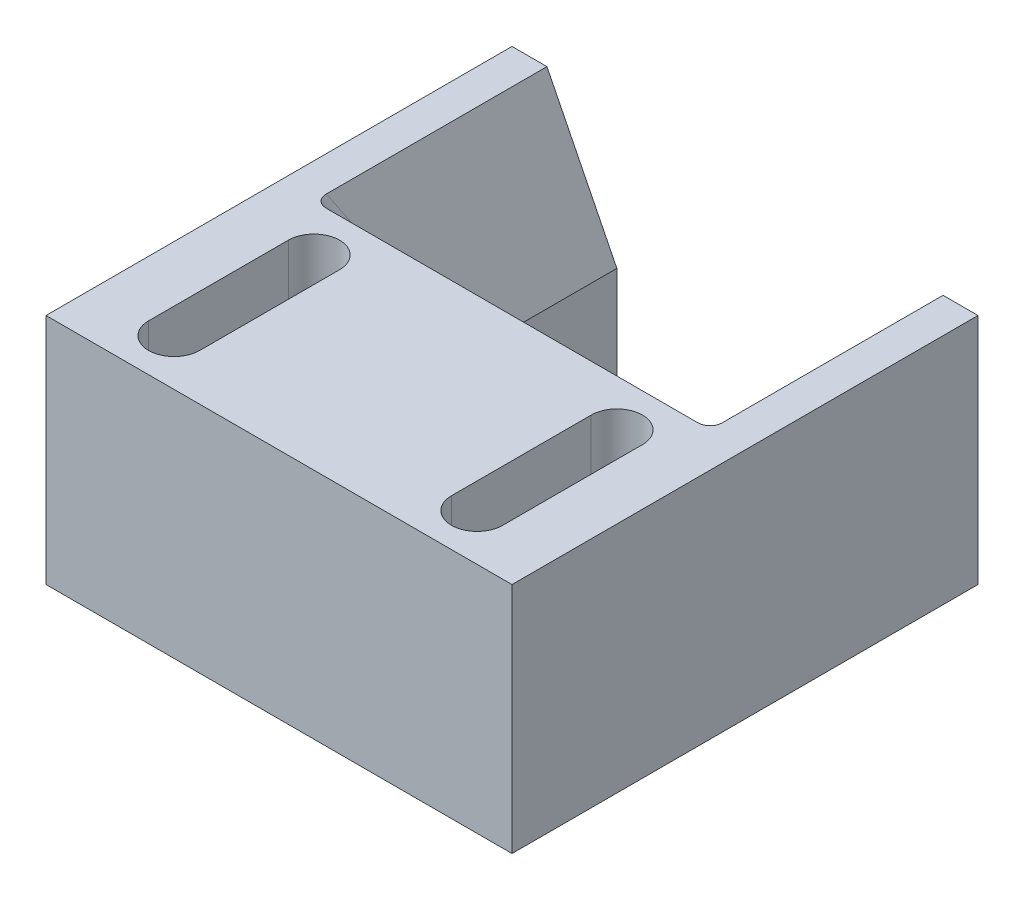
ISO-10303-21;
HEADER;
FILE_DESCRIPTION(('STEP AP214'),'2;1');
FILE_NAME('part.step','',(''),(''),'','','');
FILE_SCHEMA(('AUTOMOTIVE_DESIGN { 1 0 10303 214 1 1 1 1 }'));
ENDSEC;
DATA;
#1=APPLICATION_CONTEXT('core data for automotive mechanical design processes');
#2=APPLICATION_PROTOCOL_DEFINITION('international standard','automotive_design',2000,#1);
#3=PRODUCT_CONTEXT('',#1,'mechanical');
#4=PRODUCT('Part','Part','',(#3));
#5=PRODUCT_RELATED_PRODUCT_CATEGORY('part','',(#4));
#6=PRODUCT_DEFINITION_FORMATION('','',#4);
#7=PRODUCT_DEFINITION_CONTEXT('part definition',#1,'design');
#8=PRODUCT_DEFINITION('design','',#6,#7);
#9=PRODUCT_DEFINITION_SHAPE('','',#8);
#10=(LENGTH_UNIT() NAMED_UNIT(*) SI_UNIT(.MILLI.,.METRE.));
#11=(NAMED_UNIT(*) PLANE_ANGLE_UNIT() SI_UNIT($,.RADIAN.));
#12=(NAMED_UNIT(*) SI_UNIT($,.STERADIAN.) SOLID_ANGLE_UNIT());
#13=UNCERTAINTY_MEASURE_WITH_UNIT(LENGTH_MEASURE(1.E-05),#10,'distance_accuracy_value','');
#14=(GEOMETRIC_REPRESENTATION_CONTEXT(3) GLOBAL_UNCERTAINTY_ASSIGNED_CONTEXT((#13)) GLOBAL_UNIT_ASSIGNED_CONTEXT((#10,
#11,#12)) REPRESENTATION_CONTEXT('',''));
#15=CARTESIAN_POINT('',(0.,0.,0.));
#16=DIRECTION('',(0.,0.,1.));
#17=DIRECTION('',(1.,0.,0.));
#18=AXIS2_PLACEMENT_3D('',#15,#16,#17);
#19=CARTESIAN_POINT('',(19.4305986891669,10.5694013108329,-73.0694013108331));
#20=DIRECTION('',(-0.408248290463861,-0.816496580927728,-0.408248290463862));
#21=DIRECTION('',(0.,0.447213595499956,-0.894427190999917));
#22=AXIS2_PLACEMENT_3D('',#19,#20,#21);
#23=CYLINDRICAL_SURFACE('',#22,3.);
#24=CARTESIAN_POINT('',(27.4848084590154,19.9696169180305,-67.6984731139844));
#25=CARTESIAN_POINT('',(27.3351906609154,19.6703813218306,-66.2174095999172));
#26=CARTESIAN_POINT('',(26.2825904000829,19.6703813218306,-65.1648093390847));
#27=CARTESIAN_POINT('',(24.8015268860157,19.9696169180305,-65.0151915409846));
#28=(BOUNDED_CURVE() B_SPLINE_CURVE(3,(#24,#25,#26,#27),.UNSPECIFIED.,.F.,
.F.) B_SPLINE_CURVE_WITH_KNOTS((4,4),(5.5984661041773,6.96790451018187),
.UNSPECIFIED.) CURVE() GEOMETRIC_REPRESENTATION_ITEM() RATIONAL_B_SPLINE_CURVE((1.,
0.849731112827654,0.849731112827654,1.)) REPRESENTATION_ITEM(''));
#29=CARTESIAN_POINT('',(27.4848084590154,19.9696169180305,-67.6984731139844));
#30=VERTEX_POINT('',#29);
#31=CARTESIAN_POINT('',(24.8015268860157,19.9696169180305,-65.0151915409846));
#32=VERTEX_POINT('',#31);
#33=EDGE_CURVE('E11',#30,#32,#28,.T.);
#34=ORIENTED_EDGE('',*,*,#33,.T.);
#35=DIRECTION('',(-0.408248290463861,-0.816496580927728,-0.408248290463862));
#36=VECTOR('',#35,1.);
#37=CARTESIAN_POINT('',(25.2639320225002,20.8944271909997,-64.5527864045001));
#38=LINE('',#37,#36);
#39=CARTESIAN_POINT('',(39.8167184270002,50.,-50.));
#40=VERTEX_POINT('',#39);
#41=EDGE_CURVE('E248',#40,#32,#38,.T.);
#42=ORIENTED_EDGE('',*,*,#41,.F.);
#43=CARTESIAN_POINT('',(42.5,50.,-52.6832815729998));
#44=CARTESIAN_POINT('',(42.5,50.,-51.0526002608325));
#45=CARTESIAN_POINT('',(41.4473997391674,50.,-50.));
#46=CARTESIAN_POINT('',(39.8167184270002,50.,-50.));
#47=(BOUNDED_CURVE() B_SPLINE_CURVE(3,(#43,#44,#45,#46),.UNSPECIFIED.,.F.,
.F.) B_SPLINE_CURVE_WITH_KNOTS((4,4),(2.45687345058751,3.82631185659208),
.UNSPECIFIED.) CURVE() GEOMETRIC_REPRESENTATION_ITEM() RATIONAL_B_SPLINE_CURVE((1.,
0.849731112827656,0.849731112827656,1.)) REPRESENTATION_ITEM(''));
#48=CARTESIAN_POINT('',(42.5,50.,-52.6832815729998));
#49=VERTEX_POINT('',#48);
#50=EDGE_CURVE('E21',#49,#40,#47,.T.);
#51=ORIENTED_EDGE('',*,*,#50,.F.);
#52=DIRECTION('',(0.408248290463861,0.816496580927728,0.408248290463862));
#53=VECTOR('',#52,1.);
#54=CARTESIAN_POINT('',(42.9472135954999,50.8944271909999,-52.2360679774998));
#55=LINE('',#54,#53);
#56=EDGE_CURVE('E458',#30,#49,#55,.T.);
#57=ORIENTED_EDGE('',*,*,#56,.F.);
#58=EDGE_LOOP('',(#34,#42,#51,#57));
#59=FACE_BOUND('',#58,.T.);
#60=ADVANCED_FACE('F17',(#59),#23,.F.);
#61=CARTESIAN_POINT('',(24.5,-0.001000000000001,-68.));
#62=DIRECTION('',(0.,-1.,0.));
#63=DIRECTION('',(0.,0.,-1.));
#64=AXIS2_PLACEMENT_3D('',#61,#62,#63);
#65=CYLINDRICAL_SURFACE('',#64,3.);
#66=DIRECTION('',(0.,-1.,0.));
#67=VECTOR('',#66,1.);
#68=CARTESIAN_POINT('',(24.5,0.,-65.));
#69=LINE('',#68,#67);
#70=CARTESIAN_POINT('',(24.5,20.,-65.));
#71=VERTEX_POINT('',#70);
#72=CARTESIAN_POINT('',(24.5,0.,-65.));
#73=VERTEX_POINT('',#72);
#74=EDGE_CURVE('E366',#71,#73,#69,.T.);
#75=ORIENTED_EDGE('',*,*,#74,.F.);
#76=CARTESIAN_POINT('',(24.8015268860157,19.9696169180305,-65.0151915409846));
#77=CARTESIAN_POINT('',(24.7013154194084,19.9898637458482,-65.0050681270758));
#78=CARTESIAN_POINT('',(24.6007215048972,19.9999999999998,-64.9999999999999));
#79=CARTESIAN_POINT('',(24.5,20.,-65.));
#80=(BOUNDED_CURVE() B_SPLINE_CURVE(3,(#76,#77,#78,#79),.UNSPECIFIED.,.F.,
.F.) B_SPLINE_CURVE_WITH_KNOTS((4,4),(3.04091369319463,3.14159265358979),
.UNSPECIFIED.) CURVE() GEOMETRIC_REPRESENTATION_ITEM() RATIONAL_B_SPLINE_CURVE((1.,
0.999155490603764,0.999155490603764,1.)) REPRESENTATION_ITEM(''));
#81=EDGE_CURVE('E255',#32,#71,#80,.T.);
#82=ORIENTED_EDGE('',*,*,#81,.F.);
#83=ORIENTED_EDGE('',*,*,#33,.F.);
#84=CARTESIAN_POINT('',(27.5,20.,-68.));
#85=CARTESIAN_POINT('',(27.5,19.9999999999998,-67.8992784951028));
#86=CARTESIAN_POINT('',(27.4949318729242,19.9898637458481,-67.7986845805917));
#87=CARTESIAN_POINT('',(27.4848084590154,19.9696169180305,-67.6984731139844));
#88=(BOUNDED_CURVE() B_SPLINE_CURVE(3,(#84,#85,#86,#87),.UNSPECIFIED.,.F.,
.F.) B_SPLINE_CURVE_WITH_KNOTS((4,4),(3.1415926535898,3.24227161398495),
.UNSPECIFIED.) CURVE() GEOMETRIC_REPRESENTATION_ITEM() RATIONAL_B_SPLINE_CURVE((1.,
0.999155490603764,0.999155490603764,1.)) REPRESENTATION_ITEM(''));
#89=CARTESIAN_POINT('',(27.5,20.,-68.));
#90=VERTEX_POINT('',#89);
#91=EDGE_CURVE('E383',#90,#30,#88,.T.);
#92=ORIENTED_EDGE('',*,*,#91,.F.);
#93=DIRECTION('',(0.,1.,0.));
#94=VECTOR('',#93,1.);
#95=CARTESIAN_POINT('',(27.5,20.,-68.));
#96=LINE('',#95,#94);
#97=CARTESIAN_POINT('',(27.5,0.,-68.));
#98=VERTEX_POINT('',#97);
#99=EDGE_CURVE('E404',#98,#90,#96,.T.);
#100=ORIENTED_EDGE('',*,*,#99,.F.);
#101=CARTESIAN_POINT('',(24.5,0.,-68.));
#102=DIRECTION('',(0.,1.,0.));
#103=DIRECTION('',(0.,0.,1.));
#104=AXIS2_PLACEMENT_3D('',#101,#102,#103);
#105=CIRCLE('',#104,3.);
#106=EDGE_CURVE('E330',#73,#98,#105,.T.);
#107=ORIENTED_EDGE('',*,*,#106,.F.);
#108=EDGE_LOOP('',(#75,#82,#83,#92,#100,#107));
#109=FACE_BOUND('',#108,.T.);
#110=ADVANCED_FACE('F790',(#109),#65,.F.);
#111=CARTESIAN_POINT('',(-19.4305986891669,10.5694013108329,-73.0694013108331));
#112=DIRECTION('',(-0.408248290463861,0.816496580927728,0.408248290463862));
#113=DIRECTION('',(0.,-0.447213595499956,0.894427190999917));
#114=AXIS2_PLACEMENT_3D('',#111,#112,#113);
#115=CYLINDRICAL_SURFACE('',#114,3.);
#116=CARTESIAN_POINT('',(-39.8167184270002,50.,-50.));
#117=CARTESIAN_POINT('',(-41.4473997391675,50.,-50.));
#118=CARTESIAN_POINT('',(-42.5,50.,-51.0526002608326));
#119=CARTESIAN_POINT('',(-42.5,50.,-52.6832815729998));
#120=(BOUNDED_CURVE() B_SPLINE_CURVE(3,(#116,#117,#118,#119),.UNSPECIFIED.,.F.,
.F.) B_SPLINE_CURVE_WITH_KNOTS((4,4),(5.5984661041773,6.96790451018187),
.UNSPECIFIED.) CURVE() GEOMETRIC_REPRESENTATION_ITEM() RATIONAL_B_SPLINE_CURVE((1.,
0.849731112827655,0.849731112827655,1.)) REPRESENTATION_ITEM(''));
#121=CARTESIAN_POINT('',(-39.8167184270002,50.,-50.));
#122=VERTEX_POINT('',#121);
#123=CARTESIAN_POINT('',(-42.5,50.,-52.6832815729998));
#124=VERTEX_POINT('',#123);
#125=EDGE_CURVE('E268',#122,#124,#120,.T.);
#126=ORIENTED_EDGE('',*,*,#125,.F.);
#127=DIRECTION('',(-0.408248290463861,0.816496580927728,0.408248290463862));
#128=VECTOR('',#127,1.);
#129=CARTESIAN_POINT('',(-40.2639320225003,50.8944271909999,-49.5527864045));
#130=LINE('',#129,#128);
#131=CARTESIAN_POINT('',(-24.8015268860157,19.9696169180305,-65.0151915409846));
#132=VERTEX_POINT('',#131);
#133=EDGE_CURVE('E256',#132,#122,#130,.T.);
#134=ORIENTED_EDGE('',*,*,#133,.F.);
#135=CARTESIAN_POINT('',(-24.8015268860157,19.9696169180305,-65.0151915409846));
#136=CARTESIAN_POINT('',(-26.2825904000829,19.6703813218306,-65.1648093390846));
#137=CARTESIAN_POINT('',(-27.3351906609154,19.6703813218306,-66.2174095999172));
#138=CARTESIAN_POINT('',(-27.4848084590154,19.9696169180305,-67.6984731139844));
#139=(BOUNDED_CURVE() B_SPLINE_CURVE(3,(#135,#136,#137,#138),.UNSPECIFIED.,.F.,
.F.) B_SPLINE_CURVE_WITH_KNOTS((4,4),(5.59846610417731,6.96790451018188),
.UNSPECIFIED.) CURVE() GEOMETRIC_REPRESENTATION_ITEM() RATIONAL_B_SPLINE_CURVE((1.,
0.849731112827655,0.849731112827655,1.)) REPRESENTATION_ITEM(''));
#140=CARTESIAN_POINT('',(-27.4848084590154,19.9696169180305,-67.6984731139844));
#141=VERTEX_POINT('',#140);
#142=EDGE_CURVE('E30',#132,#141,#139,.T.);
#143=ORIENTED_EDGE('',*,*,#142,.T.);
#144=DIRECTION('',(0.408248290463861,-0.816496580927728,-0.408248290463862));
#145=VECTOR('',#144,1.);
#146=CARTESIAN_POINT('',(-27.9472135955,20.8944271909997,-67.2360679774998));
#147=LINE('',#146,#145);
#148=EDGE_CURVE('E384',#124,#141,#147,.T.);
#149=ORIENTED_EDGE('',*,*,#148,.F.);
#150=EDGE_LOOP('',(#126,#134,#143,#149));
#151=FACE_BOUND('',#150,.T.);
#152=ADVANCED_FACE('F518',(#151),#115,.F.);
#153=CARTESIAN_POINT('',(-24.5,-0.001000000000001,-68.));
#154=DIRECTION('',(0.,-1.,0.));
#155=DIRECTION('',(0.,0.,-1.));
#156=AXIS2_PLACEMENT_3D('',#153,#154,#155);
#157=CYLINDRICAL_SURFACE('',#156,3.);
#158=DIRECTION('',(0.,-1.,0.));
#159=VECTOR('',#158,1.);
#160=CARTESIAN_POINT('',(-27.5,0.,-68.));
#161=LINE('',#160,#159);
#162=CARTESIAN_POINT('',(-27.5,20.,-68.));
#163=VERTEX_POINT('',#162);
#164=CARTESIAN_POINT('',(-27.5,0.,-68.));
#165=VERTEX_POINT('',#164);
#166=EDGE_CURVE('E401',#163,#165,#161,.T.);
#167=ORIENTED_EDGE('',*,*,#166,.F.);
#168=CARTESIAN_POINT('',(-27.4848084590154,19.9696169180305,-67.6984731139844));
#169=CARTESIAN_POINT('',(-27.4949318729242,19.9898637458481,-67.7986845805917));
#170=CARTESIAN_POINT('',(-27.5,19.9999999999998,-67.8992784951028));
#171=CARTESIAN_POINT('',(-27.5,20.,-68.));
#172=(BOUNDED_CURVE() B_SPLINE_CURVE(3,(#168,#169,#170,#171),.UNSPECIFIED.,.F.,
.F.) B_SPLINE_CURVE_WITH_KNOTS((4,4),(3.04091369319463,3.1415926535898),
.UNSPECIFIED.) CURVE() GEOMETRIC_REPRESENTATION_ITEM() RATIONAL_B_SPLINE_CURVE((1.,
0.999155490603764,0.999155490603764,1.)) REPRESENTATION_ITEM(''));
#173=EDGE_CURVE('E377',#141,#163,#172,.T.);
#174=ORIENTED_EDGE('',*,*,#173,.F.);
#175=ORIENTED_EDGE('',*,*,#142,.F.);
#176=CARTESIAN_POINT('',(-24.5,20.,-65.));
#177=CARTESIAN_POINT('',(-24.6007215048972,19.9999999999998,-64.9999999999999));
#178=CARTESIAN_POINT('',(-24.7013154194084,19.9898637458481,-65.0050681270758));
#179=CARTESIAN_POINT('',(-24.8015268860157,19.9696169180305,-65.0151915409846));
#180=(BOUNDED_CURVE() B_SPLINE_CURVE(3,(#176,#177,#178,#179),.UNSPECIFIED.,.F.,
.F.) B_SPLINE_CURVE_WITH_KNOTS((4,4),(3.1415926535898,3.24227161398496),
.UNSPECIFIED.) CURVE() GEOMETRIC_REPRESENTATION_ITEM() RATIONAL_B_SPLINE_CURVE((1.,
0.999155490603764,0.999155490603764,1.)) REPRESENTATION_ITEM(''));
#181=CARTESIAN_POINT('',(-24.5,20.,-65.));
#182=VERTEX_POINT('',#181);
#183=EDGE_CURVE('E461',#182,#132,#180,.T.);
#184=ORIENTED_EDGE('',*,*,#183,.F.);
#185=DIRECTION('',(0.,1.,0.));
#186=VECTOR('',#185,1.);
#187=CARTESIAN_POINT('',(-24.5,20.,-65.));
#188=LINE('',#187,#186);
#189=CARTESIAN_POINT('',(-24.5,0.,-65.));
#190=VERTEX_POINT('',#189);
#191=EDGE_CURVE('E370',#190,#182,#188,.T.);
#192=ORIENTED_EDGE('',*,*,#191,.F.);
#193=CARTESIAN_POINT('',(-24.5,0.,-68.));
#194=DIRECTION('',(0.,1.,0.));
#195=DIRECTION('',(0.,0.,1.));
#196=AXIS2_PLACEMENT_3D('',#193,#194,#195);
#197=CIRCLE('',#196,3.);
#198=EDGE_CURVE('E331',#165,#190,#197,.T.);
#199=ORIENTED_EDGE('',*,*,#198,.F.);
#200=EDGE_LOOP('',(#167,#174,#175,#184,#192,#199));
#201=FACE_BOUND('',#200,.T.);
#202=ADVANCED_FACE('F519',(#201),#157,.F.);
#203=CARTESIAN_POINT('',(-27.5,20.,-65.));
#204=DIRECTION('',(0.,-0.447213595499956,0.894427190999917));
#205=DIRECTION('',(-1.,0.,0.));
#206=AXIS2_PLACEMENT_3D('',#203,#204,#205);
#207=PLANE('',#206);
#208=DIRECTION('',(1.,0.,0.));
#209=VECTOR('',#208,1.);
#210=CARTESIAN_POINT('',(-27.5,20.,-65.));
#211=LINE('',#210,#209);
#212=EDGE_CURVE('E371',#182,#71,#211,.T.);
#213=ORIENTED_EDGE('',*,*,#212,.F.);
#214=ORIENTED_EDGE('',*,*,#183,.T.);
#215=ORIENTED_EDGE('',*,*,#133,.T.);
#216=DIRECTION('',(-1.,0.,0.));
#217=VECTOR('',#216,1.);
#218=CARTESIAN_POINT('',(50.,50.,-50.));
#219=LINE('',#218,#217);
#220=EDGE_CURVE('E259',#40,#122,#219,.T.);
#221=ORIENTED_EDGE('',*,*,#220,.F.);
#222=ORIENTED_EDGE('',*,*,#41,.T.);
#223=ORIENTED_EDGE('',*,*,#81,.T.);
#224=EDGE_LOOP('',(#213,#214,#215,#221,#222,#223));
#225=FACE_BOUND('',#224,.T.);
#226=ADVANCED_FACE('F261',(#225),#207,.F.);
#227=CARTESIAN_POINT('',(27.5,20.,-100.));
#228=DIRECTION('',(0.894427190999917,-0.447213595499956,0.));
#229=DIRECTION('',(0.,0.,-1.));
#230=AXIS2_PLACEMENT_3D('',#227,#228,#229);
#231=PLANE('',#230);
#232=DIRECTION('',(0.,0.,-1.));
#233=VECTOR('',#232,1.);
#234=CARTESIAN_POINT('',(27.5,20.,-100.));
#235=LINE('',#234,#233);
#236=CARTESIAN_POINT('',(27.5,20.,-100.));
#237=VERTEX_POINT('',#236);
#238=EDGE_CURVE('E420',#90,#237,#235,.T.);
#239=ORIENTED_EDGE('',*,*,#238,.F.);
#240=ORIENTED_EDGE('',*,*,#91,.T.);
#241=ORIENTED_EDGE('',*,*,#56,.T.);
#242=DIRECTION('',(0.,0.,1.));
#243=VECTOR('',#242,1.);
#244=CARTESIAN_POINT('',(42.5,50.,0.));
#245=LINE('',#244,#243);
#246=CARTESIAN_POINT('',(42.5,50.,-100.));
#247=VERTEX_POINT('',#246);
#248=EDGE_CURVE('E273',#247,#49,#245,.T.);
#249=ORIENTED_EDGE('',*,*,#248,.F.);
#250=DIRECTION('',(0.447213595499956,0.894427190999917,0.));
#251=VECTOR('',#250,1.);
#252=CARTESIAN_POINT('',(27.5,20.,-100.));
#253=LINE('',#252,#251);
#254=EDGE_CURVE('E332',#237,#247,#253,.T.);
#255=ORIENTED_EDGE('',*,*,#254,.F.);
#256=EDGE_LOOP('',(#239,#240,#241,#249,#255));
#257=FACE_BOUND('',#256,.T.);
#258=ADVANCED_FACE('F721',(#257),#231,.F.);
#259=CARTESIAN_POINT('',(-27.5,20.,-100.));
#260=DIRECTION('',(-0.894427190999917,-0.447213595499956,0.));
#261=DIRECTION('',(-0.447213595499956,0.894427190999917,0.));
#262=AXIS2_PLACEMENT_3D('',#259,#260,#261);
#263=PLANE('',#262);
#264=DIRECTION('',(0.,0.,-1.));
#265=VECTOR('',#264,1.);
#266=CARTESIAN_POINT('',(-42.5,50.,0.));
#267=LINE('',#266,#265);
#268=CARTESIAN_POINT('',(-42.5,50.,-100.));
#269=VERTEX_POINT('',#268);
#270=EDGE_CURVE('E400',#124,#269,#267,.T.);
#271=ORIENTED_EDGE('',*,*,#270,.F.);
#272=ORIENTED_EDGE('',*,*,#148,.T.);
#273=ORIENTED_EDGE('',*,*,#173,.T.);
#274=DIRECTION('',(0.,0.,1.));
#275=VECTOR('',#274,1.);
#276=CARTESIAN_POINT('',(-27.5,20.,-100.));
#277=LINE('',#276,#275);
#278=CARTESIAN_POINT('',(-27.5,20.,-100.));
#279=VERTEX_POINT('',#278);
#280=EDGE_CURVE('E405',#279,#163,#277,.T.);
#281=ORIENTED_EDGE('',*,*,#280,.F.);
#282=DIRECTION('',(0.447213595499956,-0.894427190999917,0.));
#283=VECTOR('',#282,1.);
#284=CARTESIAN_POINT('',(-27.5,20.,-100.));
#285=LINE('',#284,#283);
#286=EDGE_CURVE('E158',#269,#279,#285,.T.);
#287=ORIENTED_EDGE('',*,*,#286,.F.);
#288=EDGE_LOOP('',(#271,#272,#273,#281,#287));
#289=FACE_BOUND('',#288,.T.);
#290=ADVANCED_FACE('F515',(#289),#263,.F.);
#291=CARTESIAN_POINT('',(-27.,-0.001000000000001,-10.));
#292=DIRECTION('',(1.,0.,0.));
#293=DIRECTION('',(0.,1.,0.));
#294=AXIS2_PLACEMENT_3D('',#291,#292,#293);
#295=PLANE('',#294);
#296=DIRECTION('',(0.,-1.,0.));
#297=VECTOR('',#296,1.);
#298=CARTESIAN_POINT('',(-27.,-0.001000000000001,-10.));
#299=LINE('',#298,#297);
#300=CARTESIAN_POINT('',(-27.,50.,-10.));
#301=VERTEX_POINT('',#300);
#302=CARTESIAN_POINT('',(-27.,0.,-10.));
#303=VERTEX_POINT('',#302);
#304=EDGE_CURVE('E409',#301,#303,#299,.T.);
#305=ORIENTED_EDGE('',*,*,#304,.F.);
#306=DIRECTION('',(0.,0.,-1.));
#307=VECTOR('',#306,1.);
#308=CARTESIAN_POINT('',(-27.,50.,-10.));
#309=LINE('',#308,#307);
#310=CARTESIAN_POINT('',(-27.,50.,-40.));
#311=VERTEX_POINT('',#310);
#312=EDGE_CURVE('E315',#301,#311,#309,.T.);
#313=ORIENTED_EDGE('',*,*,#312,.T.);
#314=DIRECTION('',(0.,-1.,0.));
#315=VECTOR('',#314,1.);
#316=CARTESIAN_POINT('',(-27.,-0.001000000000001,-40.));
#317=LINE('',#316,#315);
#318=CARTESIAN_POINT('',(-27.,0.,-40.));
#319=VERTEX_POINT('',#318);
#320=EDGE_CURVE('E126',#311,#319,#317,.T.);
#321=ORIENTED_EDGE('',*,*,#320,.T.);
#322=DIRECTION('',(0.,0.,-1.));
#323=VECTOR('',#322,1.);
#324=CARTESIAN_POINT('',(-27.,0.,-100.));
#325=LINE('',#324,#323);
#326=EDGE_CURVE('E339',#303,#319,#325,.T.);
#327=ORIENTED_EDGE('',*,*,#326,.F.);
#328=EDGE_LOOP('',(#305,#313,#321,#327));
#329=FACE_BOUND('',#328,.T.);
#330=ADVANCED_FACE('F720',(#329),#295,.F.);
#331=CARTESIAN_POINT('',(-38.,50.,-10.));
#332=DIRECTION('',(-1.,0.,0.));
#333=DIRECTION('',(0.,0.,1.));
#334=AXIS2_PLACEMENT_3D('',#331,#332,#333);
#335=PLANE('',#334);
#336=DIRECTION('',(0.,1.,0.));
#337=VECTOR('',#336,1.);
#338=CARTESIAN_POINT('',(-38.,50.,-40.));
#339=LINE('',#338,#337);
#340=CARTESIAN_POINT('',(-38.,0.,-40.));
#341=VERTEX_POINT('',#340);
#342=CARTESIAN_POINT('',(-38.,50.,-40.));
#343=VERTEX_POINT('',#342);
#344=EDGE_CURVE('E392',#341,#343,#339,.T.);
#345=ORIENTED_EDGE('',*,*,#344,.T.);
#346=DIRECTION('',(0.,0.,-1.));
#347=VECTOR('',#346,1.);
#348=CARTESIAN_POINT('',(-38.,50.,-10.));
#349=LINE('',#348,#347);
#350=CARTESIAN_POINT('',(-38.,50.,-10.));
#351=VERTEX_POINT('',#350);
#352=EDGE_CURVE('E359',#351,#343,#349,.T.);
#353=ORIENTED_EDGE('',*,*,#352,.F.);
#354=DIRECTION('',(0.,-1.,0.));
#355=VECTOR('',#354,1.);
#356=CARTESIAN_POINT('',(-38.,50.,-10.));
#357=LINE('',#356,#355);
#358=CARTESIAN_POINT('',(-38.,0.,-10.));
#359=VERTEX_POINT('',#358);
#360=EDGE_CURVE('E108',#351,#359,#357,.T.);
#361=ORIENTED_EDGE('',*,*,#360,.T.);
#362=DIRECTION('',(0.,0.,1.));
#363=VECTOR('',#362,1.);
#364=CARTESIAN_POINT('',(-38.,0.,-100.));
#365=LINE('',#364,#363);
#366=EDGE_CURVE('E303',#341,#359,#365,.T.);
#367=ORIENTED_EDGE('',*,*,#366,.F.);
#368=EDGE_LOOP('',(#345,#353,#361,#367));
#369=FACE_BOUND('',#368,.T.);
#370=ADVANCED_FACE('F778',(#369),#335,.F.);
#371=CARTESIAN_POINT('',(-32.5,50.,-10.));
#372=DIRECTION('',(0.,1.,0.));
#373=DIRECTION('',(0.,0.,1.));
#374=AXIS2_PLACEMENT_3D('',#371,#372,#373);
#375=CYLINDRICAL_SURFACE('',#374,5.5);
#376=DIRECTION('',(0.,1.,0.));
#377=VECTOR('',#376,1.);
#378=CARTESIAN_POINT('',(-32.5,50.,-4.5));
#379=LINE('',#378,#377);
#380=CARTESIAN_POINT('',(-32.5,0.,-4.5));
#381=VERTEX_POINT('',#380);
#382=CARTESIAN_POINT('',(-32.5,50.,-4.5));
#383=VERTEX_POINT('',#382);
#384=EDGE_CURVE('E423',#381,#383,#379,.T.);
#385=ORIENTED_EDGE('',*,*,#384,.F.);
#386=CARTESIAN_POINT('',(-32.5,0.,-10.));
#387=DIRECTION('',(0.,1.,0.));
#388=DIRECTION('',(0.,0.,1.));
#389=AXIS2_PLACEMENT_3D('',#386,#387,#388);
#390=CIRCLE('',#389,5.5);
#391=EDGE_CURVE('E342',#359,#381,#390,.T.);
#392=ORIENTED_EDGE('',*,*,#391,.F.);
#393=ORIENTED_EDGE('',*,*,#360,.F.);
#394=CARTESIAN_POINT('',(-32.5,50.,-10.));
#395=DIRECTION('',(0.,1.,0.));
#396=DIRECTION('',(0.,0.,1.));
#397=AXIS2_PLACEMENT_3D('',#394,#395,#396);
#398=CIRCLE('',#397,5.5);
#399=EDGE_CURVE('E350',#351,#383,#398,.T.);
#400=ORIENTED_EDGE('',*,*,#399,.T.);
#401=EDGE_LOOP('',(#385,#392,#393,#400));
#402=FACE_BOUND('',#401,.T.);
#403=ADVANCED_FACE('F19',(#402),#375,.F.);
#404=CARTESIAN_POINT('',(-32.5,50.,-40.));
#405=DIRECTION('',(0.,1.,0.));
#406=DIRECTION('',(0.,0.,1.));
#407=AXIS2_PLACEMENT_3D('',#404,#405,#406);
#408=CYLINDRICAL_SURFACE('',#407,5.5);
#409=ORIENTED_EDGE('',*,*,#320,.F.);
#410=CARTESIAN_POINT('',(-32.5,50.,-40.));
#411=DIRECTION('',(0.,1.,0.));
#412=DIRECTION('',(0.,0.,1.));
#413=AXIS2_PLACEMENT_3D('',#410,#411,#412);
#414=CIRCLE('',#413,5.5);
#415=EDGE_CURVE('E325',#311,#343,#414,.T.);
#416=ORIENTED_EDGE('',*,*,#415,.T.);
#417=ORIENTED_EDGE('',*,*,#344,.F.);
#418=CARTESIAN_POINT('',(-32.5,0.,-40.));
#419=DIRECTION('',(0.,1.,0.));
#420=DIRECTION('',(0.,0.,1.));
#421=AXIS2_PLACEMENT_3D('',#418,#419,#420);
#422=CIRCLE('',#421,5.5);
#423=EDGE_CURVE('E299',#319,#341,#422,.T.);
#424=ORIENTED_EDGE('',*,*,#423,.F.);
#425=EDGE_LOOP('',(#409,#416,#417,#424));
#426=FACE_BOUND('',#425,.T.);
#427=ADVANCED_FACE('F822',(#426),#408,.F.);
#428=CARTESIAN_POINT('',(38.,-0.001000000000001,-10.));
#429=DIRECTION('',(1.,0.,0.));
#430=DIRECTION('',(0.,1.,0.));
#431=AXIS2_PLACEMENT_3D('',#428,#429,#430);
#432=PLANE('',#431);
#433=DIRECTION('',(0.,-1.,0.));
#434=VECTOR('',#433,1.);
#435=CARTESIAN_POINT('',(38.,-0.001000000000001,-10.));
#436=LINE('',#435,#434);
#437=CARTESIAN_POINT('',(38.,50.,-10.));
#438=VERTEX_POINT('',#437);
#439=CARTESIAN_POINT('',(38.,0.,-10.));
#440=VERTEX_POINT('',#439);
#441=EDGE_CURVE('E280',#438,#440,#436,.T.);
#442=ORIENTED_EDGE('',*,*,#441,.F.);
#443=DIRECTION('',(0.,0.,-1.));
#444=VECTOR('',#443,1.);
#445=CARTESIAN_POINT('',(38.,50.,-10.));
#446=LINE('',#445,#444);
#447=CARTESIAN_POINT('',(38.,50.,-40.));
#448=VERTEX_POINT('',#447);
#449=EDGE_CURVE('E294',#438,#448,#446,.T.);
#450=ORIENTED_EDGE('',*,*,#449,.T.);
#451=DIRECTION('',(0.,-1.,0.));
#452=VECTOR('',#451,1.);
#453=CARTESIAN_POINT('',(38.,-0.001000000000001,-40.));
#454=LINE('',#453,#452);
#455=CARTESIAN_POINT('',(38.,0.,-40.));
#456=VERTEX_POINT('',#455);
#457=EDGE_CURVE('E376',#448,#456,#454,.T.);
#458=ORIENTED_EDGE('',*,*,#457,.T.);
#459=DIRECTION('',(0.,0.,-1.));
#460=VECTOR('',#459,1.);
#461=CARTESIAN_POINT('',(38.,0.,-100.));
#462=LINE('',#461,#460);
#463=EDGE_CURVE('E391',#440,#456,#462,.T.);
#464=ORIENTED_EDGE('',*,*,#463,.F.);
#465=EDGE_LOOP('',(#442,#450,#458,#464));
#466=FACE_BOUND('',#465,.T.);
#467=ADVANCED_FACE('F817',(#466),#432,.F.);
#468=CARTESIAN_POINT('',(27.,50.,-10.));
#469=DIRECTION('',(-1.,0.,0.));
#470=DIRECTION('',(0.,0.,1.));
#471=AXIS2_PLACEMENT_3D('',#468,#469,#470);
#472=PLANE('',#471);
#473=DIRECTION('',(0.,1.,0.));
#474=VECTOR('',#473,1.);
#475=CARTESIAN_POINT('',(27.,50.,-40.));
#476=LINE('',#475,#474);
#477=CARTESIAN_POINT('',(27.,0.,-40.));
#478=VERTEX_POINT('',#477);
#479=CARTESIAN_POINT('',(27.,50.,-40.));
#480=VERTEX_POINT('',#479);
#481=EDGE_CURVE('E372',#478,#480,#476,.T.);
#482=ORIENTED_EDGE('',*,*,#481,.T.);
#483=DIRECTION('',(0.,0.,-1.));
#484=VECTOR('',#483,1.);
#485=CARTESIAN_POINT('',(27.,50.,-10.));
#486=LINE('',#485,#484);
#487=CARTESIAN_POINT('',(27.,50.,-10.));
#488=VERTEX_POINT('',#487);
#489=EDGE_CURVE('E308',#488,#480,#486,.T.);
#490=ORIENTED_EDGE('',*,*,#489,.F.);
#491=DIRECTION('',(0.,-1.,0.));
#492=VECTOR('',#491,1.);
#493=CARTESIAN_POINT('',(27.,50.,-10.));
#494=LINE('',#493,#492);
#495=CARTESIAN_POINT('',(27.,0.,-10.));
#496=VERTEX_POINT('',#495);
#497=EDGE_CURVE('E375',#488,#496,#494,.T.);
#498=ORIENTED_EDGE('',*,*,#497,.T.);
#499=DIRECTION('',(0.,0.,1.));
#500=VECTOR('',#499,1.);
#501=CARTESIAN_POINT('',(27.,0.,-100.));
#502=LINE('',#501,#500);
#503=EDGE_CURVE('E347',#478,#496,#502,.T.);
#504=ORIENTED_EDGE('',*,*,#503,.F.);
#505=EDGE_LOOP('',(#482,#490,#498,#504));
#506=FACE_BOUND('',#505,.T.);
#507=ADVANCED_FACE('F821',(#506),#472,.F.);
#508=CARTESIAN_POINT('',(32.5,50.,-10.));
#509=DIRECTION('',(0.,1.,0.));
#510=DIRECTION('',(0.,0.,1.));
#511=AXIS2_PLACEMENT_3D('',#508,#509,#510);
#512=CYLINDRICAL_SURFACE('',#511,5.5);
#513=DIRECTION('',(0.,1.,0.));
#514=VECTOR('',#513,1.);
#515=CARTESIAN_POINT('',(32.5,50.,-4.5));
#516=LINE('',#515,#514);
#517=CARTESIAN_POINT('',(32.5,0.,-4.5));
#518=VERTEX_POINT('',#517);
#519=CARTESIAN_POINT('',(32.5,50.,-4.5));
#520=VERTEX_POINT('',#519);
#521=EDGE_CURVE('E317',#518,#520,#516,.T.);
#522=ORIENTED_EDGE('',*,*,#521,.F.);
#523=CARTESIAN_POINT('',(32.5,0.,-10.));
#524=DIRECTION('',(0.,1.,0.));
#525=DIRECTION('',(0.,0.,1.));
#526=AXIS2_PLACEMENT_3D('',#523,#524,#525);
#527=CIRCLE('',#526,5.5);
#528=EDGE_CURVE('E536',#496,#518,#527,.T.);
#529=ORIENTED_EDGE('',*,*,#528,.F.);
#530=ORIENTED_EDGE('',*,*,#497,.F.);
#531=CARTESIAN_POINT('',(32.5,50.,-10.));
#532=DIRECTION('',(0.,1.,0.));
#533=DIRECTION('',(0.,0.,1.));
#534=AXIS2_PLACEMENT_3D('',#531,#532,#533);
#535=CIRCLE('',#534,5.5);
#536=EDGE_CURVE('E297',#488,#520,#535,.T.);
#537=ORIENTED_EDGE('',*,*,#536,.T.);
#538=EDGE_LOOP('',(#522,#529,#530,#537));
#539=FACE_BOUND('',#538,.T.);
#540=ADVANCED_FACE('F846',(#539),#512,.F.);
#541=CARTESIAN_POINT('',(32.5,50.,-40.));
#542=DIRECTION('',(0.,1.,0.));
#543=DIRECTION('',(0.,0.,1.));
#544=AXIS2_PLACEMENT_3D('',#541,#542,#543);
#545=CYLINDRICAL_SURFACE('',#544,5.5);
#546=ORIENTED_EDGE('',*,*,#457,.F.);
#547=CARTESIAN_POINT('',(32.5,50.,-40.));
#548=DIRECTION('',(0.,1.,0.));
#549=DIRECTION('',(0.,0.,1.));
#550=AXIS2_PLACEMENT_3D('',#547,#548,#549);
#551=CIRCLE('',#550,5.5);
#552=EDGE_CURVE('E312',#448,#480,#551,.T.);
#553=ORIENTED_EDGE('',*,*,#552,.T.);
#554=ORIENTED_EDGE('',*,*,#481,.F.);
#555=CARTESIAN_POINT('',(32.5,0.,-40.));
#556=DIRECTION('',(0.,1.,0.));
#557=DIRECTION('',(0.,0.,1.));
#558=AXIS2_PLACEMENT_3D('',#555,#556,#557);
#559=CIRCLE('',#558,5.5);
#560=EDGE_CURVE('E341',#456,#478,#559,.T.);
#561=ORIENTED_EDGE('',*,*,#560,.F.);
#562=EDGE_LOOP('',(#546,#553,#554,#561));
#563=FACE_BOUND('',#562,.T.);
#564=ADVANCED_FACE('F838',(#563),#545,.F.);
#565=CARTESIAN_POINT('',(-27.5,-0.001000000000001,-65.));
#566=DIRECTION('',(0.,0.,1.));
#567=DIRECTION('',(1.,0.,0.));
#568=AXIS2_PLACEMENT_3D('',#565,#566,#567);
#569=PLANE('',#568);
#570=ORIENTED_EDGE('',*,*,#212,.T.);
#571=ORIENTED_EDGE('',*,*,#74,.T.);
#572=DIRECTION('',(-1.,0.,0.));
#573=VECTOR('',#572,1.);
#574=CARTESIAN_POINT('',(-27.5,0.,-65.));
#575=LINE('',#574,#573);
#576=EDGE_CURVE('E326',#73,#190,#575,.T.);
#577=ORIENTED_EDGE('',*,*,#576,.T.);
#578=ORIENTED_EDGE('',*,*,#191,.T.);
#579=EDGE_LOOP('',(#570,#571,#577,#578));
#580=FACE_BOUND('',#579,.T.);
#581=ADVANCED_FACE('F479',(#580),#569,.F.);
#582=CARTESIAN_POINT('',(27.5,-0.001000000000001,-100.));
#583=DIRECTION('',(1.,0.,0.));
#584=DIRECTION('',(0.,1.,0.));
#585=AXIS2_PLACEMENT_3D('',#582,#583,#584);
#586=PLANE('',#585);
#587=DIRECTION('',(0.,0.,1.));
#588=VECTOR('',#587,1.);
#589=CARTESIAN_POINT('',(27.5,0.,-100.));
#590=LINE('',#589,#588);
#591=CARTESIAN_POINT('',(27.5,0.,-100.));
#592=VERTEX_POINT('',#591);
#593=EDGE_CURVE('E1140',#592,#98,#590,.T.);
#594=ORIENTED_EDGE('',*,*,#593,.T.);
#595=ORIENTED_EDGE('',*,*,#99,.T.);
#596=ORIENTED_EDGE('',*,*,#238,.T.);
#597=DIRECTION('',(0.,1.,0.));
#598=VECTOR('',#597,1.);
#599=CARTESIAN_POINT('',(27.5,-0.001000000000001,-100.));
#600=LINE('',#599,#598);
#601=EDGE_CURVE('E334',#592,#237,#600,.T.);
#602=ORIENTED_EDGE('',*,*,#601,.F.);
#603=EDGE_LOOP('',(#594,#595,#596,#602));
#604=FACE_BOUND('',#603,.T.);
#605=ADVANCED_FACE('F730',(#604),#586,.F.);
#606=CARTESIAN_POINT('',(-27.5,-0.001000000000001,-100.));
#607=DIRECTION('',(-1.,0.,0.));
#608=DIRECTION('',(0.,0.,1.));
#609=AXIS2_PLACEMENT_3D('',#606,#607,#608);
#610=PLANE('',#609);
#611=ORIENTED_EDGE('',*,*,#280,.T.);
#612=ORIENTED_EDGE('',*,*,#166,.T.);
#613=DIRECTION('',(0.,0.,-1.));
#614=VECTOR('',#613,1.);
#615=CARTESIAN_POINT('',(-27.5,0.,-100.));
#616=LINE('',#615,#614);
#617=CARTESIAN_POINT('',(-27.5,0.,-100.));
#618=VERTEX_POINT('',#617);
#619=EDGE_CURVE('E354',#165,#618,#616,.T.);
#620=ORIENTED_EDGE('',*,*,#619,.T.);
#621=DIRECTION('',(0.,1.,0.));
#622=VECTOR('',#621,1.);
#623=CARTESIAN_POINT('',(-27.5,-0.001000000000001,-100.));
#624=LINE('',#623,#622);
#625=EDGE_CURVE('E324',#618,#279,#624,.T.);
#626=ORIENTED_EDGE('',*,*,#625,.T.);
#627=EDGE_LOOP('',(#611,#612,#620,#626));
#628=FACE_BOUND('',#627,.T.);
#629=ADVANCED_FACE('F505',(#628),#610,.F.);
#630=CARTESIAN_POINT('',(-50.,0.,0.));
#631=DIRECTION('',(-1.,0.,0.));
#632=DIRECTION('',(0.,0.,1.));
#633=AXIS2_PLACEMENT_3D('',#630,#631,#632);
#634=PLANE('',#633);
#635=DIRECTION('',(0.,-1.,0.));
#636=VECTOR('',#635,1.);
#637=CARTESIAN_POINT('',(-50.,0.,0.));
#638=LINE('',#637,#636);
#639=CARTESIAN_POINT('',(-50.,50.,0.));
#640=VERTEX_POINT('',#639);
#641=CARTESIAN_POINT('',(-50.,0.,0.));
#642=VERTEX_POINT('',#641);
#643=EDGE_CURVE('E465',#640,#642,#638,.T.);
#644=ORIENTED_EDGE('',*,*,#643,.F.);
#645=DIRECTION('',(0.,0.,1.));
#646=VECTOR('',#645,1.);
#647=CARTESIAN_POINT('',(-50.,50.,0.));
#648=LINE('',#647,#646);
#649=CARTESIAN_POINT('',(-50.,50.,-100.));
#650=VERTEX_POINT('',#649);
#651=EDGE_CURVE('E399',#650,#640,#648,.T.);
#652=ORIENTED_EDGE('',*,*,#651,.F.);
#653=DIRECTION('',(0.,1.,0.));
#654=VECTOR('',#653,1.);
#655=CARTESIAN_POINT('',(-50.,50.,-100.));
#656=LINE('',#655,#654);
#657=CARTESIAN_POINT('',(-50.,0.,-100.));
#658=VERTEX_POINT('',#657);
#659=EDGE_CURVE('E142',#658,#650,#656,.T.);
#660=ORIENTED_EDGE('',*,*,#659,.F.);
#661=DIRECTION('',(0.,0.,-1.));
#662=VECTOR('',#661,1.);
#663=CARTESIAN_POINT('',(-50.,0.,-100.));
#664=LINE('',#663,#662);
#665=EDGE_CURVE('E304',#642,#658,#664,.T.);
#666=ORIENTED_EDGE('',*,*,#665,.F.);
#667=EDGE_LOOP('',(#644,#652,#660,#666));
#668=FACE_BOUND('',#667,.T.);
#669=ADVANCED_FACE('F729',(#668),#634,.T.);
#670=CARTESIAN_POINT('',(50.,0.,0.));
#671=DIRECTION('',(-1.,0.,0.));
#672=DIRECTION('',(0.,0.,1.));
#673=AXIS2_PLACEMENT_3D('',#670,#671,#672);
#674=PLANE('',#673);
#675=DIRECTION('',(0.,-1.,0.));
#676=VECTOR('',#675,1.);
#677=CARTESIAN_POINT('',(50.,0.,0.));
#678=LINE('',#677,#676);
#679=CARTESIAN_POINT('',(50.,50.,0.));
#680=VERTEX_POINT('',#679);
#681=CARTESIAN_POINT('',(50.,0.,0.));
#682=VERTEX_POINT('',#681);
#683=EDGE_CURVE('E358',#680,#682,#678,.T.);
#684=ORIENTED_EDGE('',*,*,#683,.T.);
#685=DIRECTION('',(0.,0.,-1.));
#686=VECTOR('',#685,1.);
#687=CARTESIAN_POINT('',(50.,0.,-100.));
#688=LINE('',#687,#686);
#689=CARTESIAN_POINT('',(50.,0.,-100.));
#690=VERTEX_POINT('',#689);
#691=EDGE_CURVE('E338',#682,#690,#688,.T.);
#692=ORIENTED_EDGE('',*,*,#691,.T.);
#693=DIRECTION('',(0.,1.,0.));
#694=VECTOR('',#693,1.);
#695=CARTESIAN_POINT('',(50.,50.,-100.));
#696=LINE('',#695,#694);
#697=CARTESIAN_POINT('',(50.,50.,-100.));
#698=VERTEX_POINT('',#697);
#699=EDGE_CURVE('E214',#690,#698,#696,.T.);
#700=ORIENTED_EDGE('',*,*,#699,.T.);
#701=DIRECTION('',(0.,0.,1.));
#702=VECTOR('',#701,1.);
#703=CARTESIAN_POINT('',(50.,50.,0.));
#704=LINE('',#703,#702);
#705=EDGE_CURVE('E307',#698,#680,#704,.T.);
#706=ORIENTED_EDGE('',*,*,#705,.T.);
#707=EDGE_LOOP('',(#684,#692,#700,#706));
#708=FACE_BOUND('',#707,.T.);
#709=ADVANCED_FACE('F759',(#708),#674,.F.);
#710=CARTESIAN_POINT('',(50.,50.,-100.));
#711=DIRECTION('',(0.,0.,1.));
#712=DIRECTION('',(1.,0.,0.));
#713=AXIS2_PLACEMENT_3D('',#710,#711,#712);
#714=PLANE('',#713);
#715=ORIENTED_EDGE('',*,*,#601,.T.);
#716=ORIENTED_EDGE('',*,*,#254,.T.);
#717=DIRECTION('',(-1.,0.,0.));
#718=VECTOR('',#717,1.);
#719=CARTESIAN_POINT('',(50.,50.,-100.));
#720=LINE('',#719,#718);
#721=EDGE_CURVE('E298',#698,#247,#720,.T.);
#722=ORIENTED_EDGE('',*,*,#721,.F.);
#723=ORIENTED_EDGE('',*,*,#699,.F.);
#724=DIRECTION('',(-1.,0.,0.));
#725=VECTOR('',#724,1.);
#726=CARTESIAN_POINT('',(50.,0.,-100.));
#727=LINE('',#726,#725);
#728=EDGE_CURVE('E365',#690,#592,#727,.T.);
#729=ORIENTED_EDGE('',*,*,#728,.T.);
#730=EDGE_LOOP('',(#715,#716,#722,#723,#729));
#731=FACE_BOUND('',#730,.T.);
#732=ADVANCED_FACE('F763',(#731),#714,.F.);
#733=CARTESIAN_POINT('',(50.,0.,-100.));
#734=DIRECTION('',(0.,1.,0.));
#735=DIRECTION('',(1.,0.,0.));
#736=AXIS2_PLACEMENT_3D('',#733,#734,#735);
#737=PLANE('',#736);
#738=ORIENTED_EDGE('',*,*,#560,.T.);
#739=ORIENTED_EDGE('',*,*,#503,.T.);
#740=ORIENTED_EDGE('',*,*,#528,.T.);
#741=CARTESIAN_POINT('',(32.5,0.,-10.));
#742=DIRECTION('',(0.,1.,0.));
#743=DIRECTION('',(0.,0.,1.));
#744=AXIS2_PLACEMENT_3D('',#741,#742,#743);
#745=CIRCLE('',#744,5.5);
#746=EDGE_CURVE('E321',#518,#440,#745,.T.);
#747=ORIENTED_EDGE('',*,*,#746,.T.);
#748=ORIENTED_EDGE('',*,*,#463,.T.);
#749=EDGE_LOOP('',(#738,#739,#740,#747,#748));
#750=FACE_BOUND('',#749,.T.);
#751=ORIENTED_EDGE('',*,*,#423,.T.);
#752=ORIENTED_EDGE('',*,*,#366,.T.);
#753=ORIENTED_EDGE('',*,*,#391,.T.);
#754=CARTESIAN_POINT('',(-32.5,0.,-10.));
#755=DIRECTION('',(0.,1.,0.));
#756=DIRECTION('',(0.,0.,1.));
#757=AXIS2_PLACEMENT_3D('',#754,#755,#756);
#758=CIRCLE('',#757,5.5);
#759=EDGE_CURVE('E427',#381,#303,#758,.T.);
#760=ORIENTED_EDGE('',*,*,#759,.T.);
#761=ORIENTED_EDGE('',*,*,#326,.T.);
#762=EDGE_LOOP('',(#751,#752,#753,#760,#761));
#763=FACE_BOUND('',#762,.T.);
#764=DIRECTION('',(-1.,0.,0.));
#765=VECTOR('',#764,1.);
#766=CARTESIAN_POINT('',(50.,0.,-100.));
#767=LINE('',#766,#765);
#768=EDGE_CURVE('E415',#618,#658,#767,.T.);
#769=ORIENTED_EDGE('',*,*,#768,.F.);
#770=ORIENTED_EDGE('',*,*,#619,.F.);
#771=ORIENTED_EDGE('',*,*,#198,.T.);
#772=ORIENTED_EDGE('',*,*,#576,.F.);
#773=ORIENTED_EDGE('',*,*,#106,.T.);
#774=ORIENTED_EDGE('',*,*,#593,.F.);
#775=ORIENTED_EDGE('',*,*,#728,.F.);
#776=ORIENTED_EDGE('',*,*,#691,.F.);
#777=DIRECTION('',(-1.,0.,0.));
#778=VECTOR('',#777,1.);
#779=CARTESIAN_POINT('',(50.,0.,0.));
#780=LINE('',#779,#778);
#781=EDGE_CURVE('E446',#682,#642,#780,.T.);
#782=ORIENTED_EDGE('',*,*,#781,.T.);
#783=ORIENTED_EDGE('',*,*,#665,.T.);
#784=EDGE_LOOP('',(#769,#770,#771,#772,#773,#774,#775,#776,#782,#783));
#785=FACE_BOUND('',#784,.T.);
#786=ADVANCED_FACE('F510',(#750,#763,#785),#737,.F.);
#787=CARTESIAN_POINT('',(50.,0.,0.));
#788=DIRECTION('',(0.,0.,-1.));
#789=DIRECTION('',(0.,-1.,0.));
#790=AXIS2_PLACEMENT_3D('',#787,#788,#789);
#791=PLANE('',#790);
#792=ORIENTED_EDGE('',*,*,#643,.T.);
#793=ORIENTED_EDGE('',*,*,#781,.F.);
#794=ORIENTED_EDGE('',*,*,#683,.F.);
#795=DIRECTION('',(-1.,0.,0.));
#796=VECTOR('',#795,1.);
#797=CARTESIAN_POINT('',(50.,50.,0.));
#798=LINE('',#797,#796);
#799=EDGE_CURVE('E419',#680,#640,#798,.T.);
#800=ORIENTED_EDGE('',*,*,#799,.T.);
#801=EDGE_LOOP('',(#792,#793,#794,#800));
#802=FACE_BOUND('',#801,.T.);
#803=ADVANCED_FACE('F738',(#802),#791,.F.);
#804=CARTESIAN_POINT('',(50.,50.,-100.));
#805=DIRECTION('',(0.,0.,1.));
#806=DIRECTION('',(1.,0.,0.));
#807=AXIS2_PLACEMENT_3D('',#804,#805,#806);
#808=PLANE('',#807);
#809=DIRECTION('',(-1.,0.,0.));
#810=VECTOR('',#809,1.);
#811=CARTESIAN_POINT('',(50.,50.,-100.));
#812=LINE('',#811,#810);
#813=EDGE_CURVE('E395',#269,#650,#812,.T.);
#814=ORIENTED_EDGE('',*,*,#813,.F.);
#815=ORIENTED_EDGE('',*,*,#286,.T.);
#816=ORIENTED_EDGE('',*,*,#625,.F.);
#817=ORIENTED_EDGE('',*,*,#768,.T.);
#818=ORIENTED_EDGE('',*,*,#659,.T.);
#819=EDGE_LOOP('',(#814,#815,#816,#817,#818));
#820=FACE_BOUND('',#819,.T.);
#821=ADVANCED_FACE('F514',(#820),#808,.F.);
#822=CARTESIAN_POINT('',(50.,50.,0.));
#823=DIRECTION('',(0.,-1.,0.));
#824=DIRECTION('',(0.,0.,-1.));
#825=AXIS2_PLACEMENT_3D('',#822,#823,#824);
#826=PLANE('',#825);
#827=ORIENTED_EDGE('',*,*,#312,.F.);
#828=CARTESIAN_POINT('',(-32.5,50.,-10.));
#829=DIRECTION('',(0.,1.,0.));
#830=DIRECTION('',(0.,0.,1.));
#831=AXIS2_PLACEMENT_3D('',#828,#829,#830);
#832=CIRCLE('',#831,5.5);
#833=EDGE_CURVE('E292',#383,#301,#832,.T.);
#834=ORIENTED_EDGE('',*,*,#833,.F.);
#835=ORIENTED_EDGE('',*,*,#399,.F.);
#836=ORIENTED_EDGE('',*,*,#352,.T.);
#837=ORIENTED_EDGE('',*,*,#415,.F.);
#838=EDGE_LOOP('',(#827,#834,#835,#836,#837));
#839=FACE_BOUND('',#838,.T.);
#840=ORIENTED_EDGE('',*,*,#449,.F.);
#841=CARTESIAN_POINT('',(32.5,50.,-10.));
#842=DIRECTION('',(0.,1.,0.));
#843=DIRECTION('',(0.,0.,1.));
#844=AXIS2_PLACEMENT_3D('',#841,#842,#843);
#845=CIRCLE('',#844,5.5);
#846=EDGE_CURVE('E288',#520,#438,#845,.T.);
#847=ORIENTED_EDGE('',*,*,#846,.F.);
#848=ORIENTED_EDGE('',*,*,#536,.F.);
#849=ORIENTED_EDGE('',*,*,#489,.T.);
#850=ORIENTED_EDGE('',*,*,#552,.F.);
#851=EDGE_LOOP('',(#840,#847,#848,#849,#850));
#852=FACE_BOUND('',#851,.T.);
#853=ORIENTED_EDGE('',*,*,#248,.T.);
#854=ORIENTED_EDGE('',*,*,#50,.T.);
#855=ORIENTED_EDGE('',*,*,#220,.T.);
#856=ORIENTED_EDGE('',*,*,#125,.T.);
#857=ORIENTED_EDGE('',*,*,#270,.T.);
#858=ORIENTED_EDGE('',*,*,#813,.T.);
#859=ORIENTED_EDGE('',*,*,#651,.T.);
#860=ORIENTED_EDGE('',*,*,#799,.F.);
#861=ORIENTED_EDGE('',*,*,#705,.F.);
#862=ORIENTED_EDGE('',*,*,#721,.T.);
#863=EDGE_LOOP('',(#853,#854,#855,#856,#857,#858,#859,#860,#861,#862));
#864=FACE_BOUND('',#863,.T.);
#865=ADVANCED_FACE('F270',(#839,#852,#864),#826,.F.);
#866=CARTESIAN_POINT('',(32.5,50.,-10.));
#867=DIRECTION('',(0.,1.,0.));
#868=DIRECTION('',(0.,0.,1.));
#869=AXIS2_PLACEMENT_3D('',#866,#867,#868);
#870=CYLINDRICAL_SURFACE('',#869,5.5);
#871=ORIENTED_EDGE('',*,*,#746,.F.);
#872=ORIENTED_EDGE('',*,*,#521,.T.);
#873=ORIENTED_EDGE('',*,*,#846,.T.);
#874=ORIENTED_EDGE('',*,*,#441,.T.);
#875=EDGE_LOOP('',(#871,#872,#873,#874));
#876=FACE_BOUND('',#875,.T.);
#877=ADVANCED_FACE('F772',(#876),#870,.F.);
#878=CARTESIAN_POINT('',(-32.5,50.,-10.));
#879=DIRECTION('',(0.,1.,0.));
#880=DIRECTION('',(0.,0.,1.));
#881=AXIS2_PLACEMENT_3D('',#878,#879,#880);
#882=CYLINDRICAL_SURFACE('',#881,5.5);
#883=ORIENTED_EDGE('',*,*,#759,.F.);
#884=ORIENTED_EDGE('',*,*,#384,.T.);
#885=ORIENTED_EDGE('',*,*,#833,.T.);
#886=ORIENTED_EDGE('',*,*,#304,.T.);
#887=EDGE_LOOP('',(#883,#884,#885,#886));
#888=FACE_BOUND('',#887,.T.);
#889=ADVANCED_FACE('F855',(#888),#882,.F.);
#890=CLOSED_SHELL('',(#60,#110,#152,#202,#226,#258,#290,#330,#370,#403,#427,#467,#507,#540,#564,
#581,#605,#629,#669,#709,#732,#786,#803,#821,#865,#877,#889));
#891=MANIFOLD_SOLID_BREP('B1',#890);
#892=ADVANCED_BREP_SHAPE_REPRESENTATION('',(#18,#891),#14);
#893=SHAPE_DEFINITION_REPRESENTATION(#9,#892);
ENDSEC;
END-ISO-10303-21;
